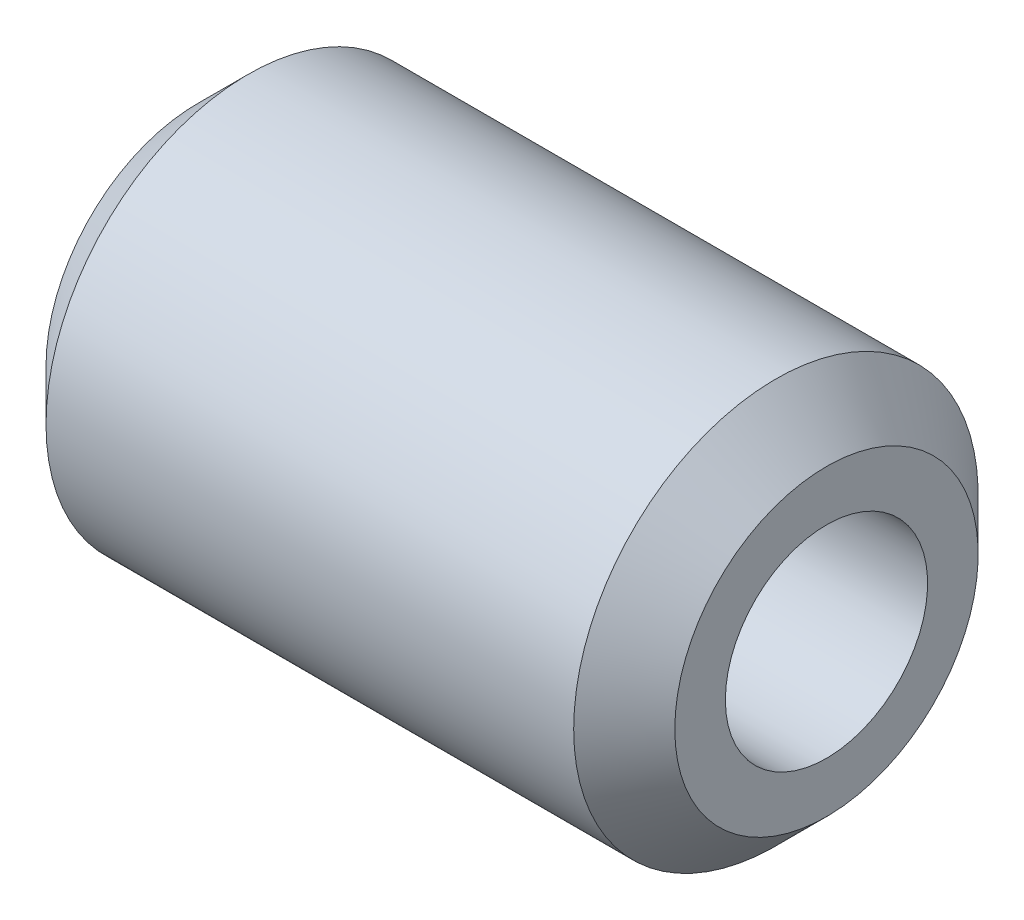
ISO-10303-21;
HEADER;
FILE_DESCRIPTION(('STEP AP214'),'2;1');
FILE_NAME('part.step','',(''),(''),'','','');
FILE_SCHEMA(('AUTOMOTIVE_DESIGN { 1 0 10303 214 1 1 1 1 }'));
ENDSEC;
DATA;
#1=APPLICATION_CONTEXT('core data for automotive mechanical design processes');
#2=APPLICATION_PROTOCOL_DEFINITION('international standard','automotive_design',2000,#1);
#3=PRODUCT_CONTEXT('',#1,'mechanical');
#4=PRODUCT('Part','Part','',(#3));
#5=PRODUCT_RELATED_PRODUCT_CATEGORY('part','',(#4));
#6=PRODUCT_DEFINITION_FORMATION('','',#4);
#7=PRODUCT_DEFINITION_CONTEXT('part definition',#1,'design');
#8=PRODUCT_DEFINITION('design','',#6,#7);
#9=PRODUCT_DEFINITION_SHAPE('','',#8);
#10=(LENGTH_UNIT() NAMED_UNIT(*) SI_UNIT(.MILLI.,.METRE.));
#11=(NAMED_UNIT(*) PLANE_ANGLE_UNIT() SI_UNIT($,.RADIAN.));
#12=(NAMED_UNIT(*) SI_UNIT($,.STERADIAN.) SOLID_ANGLE_UNIT());
#13=UNCERTAINTY_MEASURE_WITH_UNIT(LENGTH_MEASURE(1.E-05),#10,'distance_accuracy_value','');
#14=(GEOMETRIC_REPRESENTATION_CONTEXT(3) GLOBAL_UNCERTAINTY_ASSIGNED_CONTEXT((#13)) GLOBAL_UNIT_ASSIGNED_CONTEXT((#10,
#11,#12)) REPRESENTATION_CONTEXT('',''));
#15=CARTESIAN_POINT('',(0.,0.,0.));
#16=DIRECTION('',(0.,0.,1.));
#17=DIRECTION('',(1.,0.,0.));
#18=AXIS2_PLACEMENT_3D('',#15,#16,#17);
#19=CARTESIAN_POINT('',(-73.003968472948,0.,0.));
#20=DIRECTION('',(-1.,0.,0.));
#21=DIRECTION('',(0.,0.,1.));
#22=AXIS2_PLACEMENT_3D('',#19,#20,#21);
#23=CYLINDRICAL_SURFACE('',#22,5.5);
#24=CARTESIAN_POINT('',(17.1,0.,0.));
#25=DIRECTION('',(-1.,0.,0.));
#26=DIRECTION('',(0.,0.,1.));
#27=AXIS2_PLACEMENT_3D('',#24,#25,#26);
#28=CIRCLE('',#27,5.5);
#29=CARTESIAN_POINT('',(17.1,0.,5.5));
#30=VERTEX_POINT('',#29);
#31=EDGE_CURVE('E55',#30,#30,#28,.T.);
#32=ORIENTED_EDGE('',*,*,#31,.F.);
#33=EDGE_LOOP('',(#32));
#34=FACE_BOUND('',#33,.T.);
#35=CARTESIAN_POINT('',(-17.1,0.,0.));
#36=DIRECTION('',(-1.,0.,0.));
#37=DIRECTION('',(0.,0.,1.));
#38=AXIS2_PLACEMENT_3D('',#35,#36,#37);
#39=CIRCLE('',#38,5.5);
#40=CARTESIAN_POINT('',(-17.1,0.,5.5));
#41=VERTEX_POINT('',#40);
#42=EDGE_CURVE('E10',#41,#41,#39,.T.);
#43=ORIENTED_EDGE('',*,*,#42,.T.);
#44=EDGE_LOOP('',(#43));
#45=FACE_BOUND('',#44,.T.);
#46=ADVANCED_FACE('F33',(#34,#45),#23,.F.);
#47=CARTESIAN_POINT('',(-17.1,5.5,0.));
#48=DIRECTION('',(1.,0.,0.));
#49=DIRECTION('',(0.,0.,-1.));
#50=AXIS2_PLACEMENT_3D('',#47,#48,#49);
#51=PLANE('',#50);
#52=ORIENTED_EDGE('',*,*,#42,.F.);
#53=EDGE_LOOP('',(#52));
#54=FACE_BOUND('',#53,.T.);
#55=CARTESIAN_POINT('',(-17.1,0.,0.));
#56=DIRECTION('',(-1.,0.,0.));
#57=DIRECTION('',(0.,0.,1.));
#58=AXIS2_PLACEMENT_3D('',#55,#56,#57);
#59=CIRCLE('',#58,8.25);
#60=CARTESIAN_POINT('',(-17.1,0.,8.25));
#61=VERTEX_POINT('',#60);
#62=EDGE_CURVE('E39',#61,#61,#59,.T.);
#63=ORIENTED_EDGE('',*,*,#62,.T.);
#64=EDGE_LOOP('',(#63));
#65=FACE_BOUND('',#64,.T.);
#66=ADVANCED_FACE('F62',(#54,#65),#51,.F.);
#67=CARTESIAN_POINT('',(-14.35,0.,0.));
#68=DIRECTION('',(1.,0.,0.));
#69=DIRECTION('',(0.,0.,-1.));
#70=AXIS2_PLACEMENT_3D('',#67,#68,#69);
#71=CONICAL_SURFACE('',#70,11.,0.78539816339745);
#72=ORIENTED_EDGE('',*,*,#62,.F.);
#73=EDGE_LOOP('',(#72));
#74=FACE_BOUND('',#73,.T.);
#75=CARTESIAN_POINT('',(-14.35,0.,0.));
#76=DIRECTION('',(-1.,0.,0.));
#77=DIRECTION('',(0.,0.,1.));
#78=AXIS2_PLACEMENT_3D('',#75,#76,#77);
#79=CIRCLE('',#78,11.);
#80=CARTESIAN_POINT('',(-14.35,0.,11.));
#81=VERTEX_POINT('',#80);
#82=EDGE_CURVE('E43',#81,#81,#79,.T.);
#83=ORIENTED_EDGE('',*,*,#82,.T.);
#84=EDGE_LOOP('',(#83));
#85=FACE_BOUND('',#84,.T.);
#86=ADVANCED_FACE('F66',(#74,#85),#71,.T.);
#87=CARTESIAN_POINT('',(-73.003968472948,0.,0.));
#88=DIRECTION('',(-1.,0.,0.));
#89=DIRECTION('',(0.,0.,1.));
#90=AXIS2_PLACEMENT_3D('',#87,#88,#89);
#91=CYLINDRICAL_SURFACE('',#90,11.);
#92=ORIENTED_EDGE('',*,*,#82,.F.);
#93=EDGE_LOOP('',(#92));
#94=FACE_BOUND('',#93,.T.);
#95=CARTESIAN_POINT('',(14.35,0.,0.));
#96=DIRECTION('',(-1.,0.,0.));
#97=DIRECTION('',(0.,0.,1.));
#98=AXIS2_PLACEMENT_3D('',#95,#96,#97);
#99=CIRCLE('',#98,11.);
#100=CARTESIAN_POINT('',(14.35,0.,11.));
#101=VERTEX_POINT('',#100);
#102=EDGE_CURVE('E47',#101,#101,#99,.T.);
#103=ORIENTED_EDGE('',*,*,#102,.T.);
#104=EDGE_LOOP('',(#103));
#105=FACE_BOUND('',#104,.T.);
#106=ADVANCED_FACE('F71',(#94,#105),#91,.T.);
#107=CARTESIAN_POINT('',(17.1,0.,0.));
#108=DIRECTION('',(-1.,0.,0.));
#109=DIRECTION('',(0.,0.,1.));
#110=AXIS2_PLACEMENT_3D('',#107,#108,#109);
#111=CONICAL_SURFACE('',#110,8.25,0.78539816339745);
#112=ORIENTED_EDGE('',*,*,#102,.F.);
#113=EDGE_LOOP('',(#112));
#114=FACE_BOUND('',#113,.T.);
#115=CARTESIAN_POINT('',(17.1,0.,0.));
#116=DIRECTION('',(-1.,0.,0.));
#117=DIRECTION('',(0.,0.,1.));
#118=AXIS2_PLACEMENT_3D('',#115,#116,#117);
#119=CIRCLE('',#118,8.25);
#120=CARTESIAN_POINT('',(17.1,0.,8.25));
#121=VERTEX_POINT('',#120);
#122=EDGE_CURVE('E52',#121,#121,#119,.T.);
#123=ORIENTED_EDGE('',*,*,#122,.T.);
#124=EDGE_LOOP('',(#123));
#125=FACE_BOUND('',#124,.T.);
#126=ADVANCED_FACE('F77',(#114,#125),#111,.T.);
#127=CARTESIAN_POINT('',(17.1,8.25,0.));
#128=DIRECTION('',(-1.,0.,0.));
#129=DIRECTION('',(0.,0.,1.));
#130=AXIS2_PLACEMENT_3D('',#127,#128,#129);
#131=PLANE('',#130);
#132=ORIENTED_EDGE('',*,*,#122,.F.);
#133=EDGE_LOOP('',(#132));
#134=FACE_BOUND('',#133,.T.);
#135=ORIENTED_EDGE('',*,*,#31,.T.);
#136=EDGE_LOOP('',(#135));
#137=FACE_BOUND('',#136,.T.);
#138=ADVANCED_FACE('F59',(#134,#137),#131,.F.);
#139=CLOSED_SHELL('',(#46,#66,#86,#106,#126,#138));
#140=MANIFOLD_SOLID_BREP('B2',#139);
#141=ADVANCED_BREP_SHAPE_REPRESENTATION('',(#18,#140),#14);
#142=SHAPE_DEFINITION_REPRESENTATION(#9,#141);
ENDSEC;
END-ISO-10303-21;
